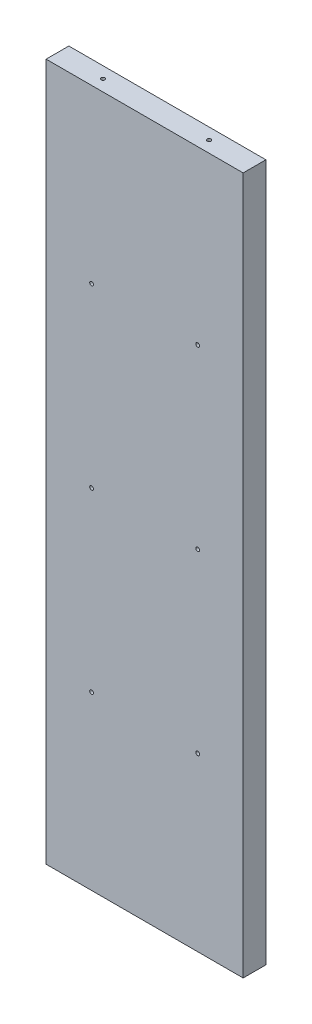
ISO-10303-21;
HEADER;
FILE_DESCRIPTION(('STEP AP214'),'2;1');
FILE_NAME('part.step','',(''),(''),'','','');
FILE_SCHEMA(('AUTOMOTIVE_DESIGN { 1 0 10303 214 1 1 1 1 }'));
ENDSEC;
DATA;
#1=APPLICATION_CONTEXT('core data for automotive mechanical design processes');
#2=APPLICATION_PROTOCOL_DEFINITION('international standard','automotive_design',2000,#1);
#3=PRODUCT_CONTEXT('',#1,'mechanical');
#4=PRODUCT('Part','Part','',(#3));
#5=PRODUCT_RELATED_PRODUCT_CATEGORY('part','',(#4));
#6=PRODUCT_DEFINITION_FORMATION('','',#4);
#7=PRODUCT_DEFINITION_CONTEXT('part definition',#1,'design');
#8=PRODUCT_DEFINITION('design','',#6,#7);
#9=PRODUCT_DEFINITION_SHAPE('','',#8);
#10=(LENGTH_UNIT() NAMED_UNIT(*) SI_UNIT(.MILLI.,.METRE.));
#11=(NAMED_UNIT(*) PLANE_ANGLE_UNIT() SI_UNIT($,.RADIAN.));
#12=(NAMED_UNIT(*) SI_UNIT($,.STERADIAN.) SOLID_ANGLE_UNIT());
#13=UNCERTAINTY_MEASURE_WITH_UNIT(LENGTH_MEASURE(1.E-05),#10,'distance_accuracy_value','');
#14=(GEOMETRIC_REPRESENTATION_CONTEXT(3) GLOBAL_UNCERTAINTY_ASSIGNED_CONTEXT((#13)) GLOBAL_UNIT_ASSIGNED_CONTEXT((#10,
#11,#12)) REPRESENTATION_CONTEXT('',''));
#15=CARTESIAN_POINT('',(0.,0.,0.));
#16=DIRECTION('',(0.,0.,1.));
#17=DIRECTION('',(1.,0.,0.));
#18=AXIS2_PLACEMENT_3D('',#15,#16,#17);
#19=CARTESIAN_POINT('',(195.,1380.,22.5));
#20=DIRECTION('',(-1.,0.,0.));
#21=DIRECTION('',(0.,0.,1.));
#22=AXIS2_PLACEMENT_3D('',#19,#20,#21);
#23=PLANE('',#22);
#24=DIRECTION('',(0.,0.,-1.));
#25=VECTOR('',#24,1.);
#26=CARTESIAN_POINT('',(195.,0.,22.5));
#27=LINE('',#26,#25);
#28=CARTESIAN_POINT('',(195.,0.,22.5));
#29=VERTEX_POINT('',#28);
#30=CARTESIAN_POINT('',(195.,0.,-22.5));
#31=VERTEX_POINT('',#30);
#32=EDGE_CURVE('E102',#29,#31,#27,.T.);
#33=ORIENTED_EDGE('',*,*,#32,.T.);
#34=DIRECTION('',(0.,-1.,0.));
#35=VECTOR('',#34,1.);
#36=CARTESIAN_POINT('',(195.,1380.,-22.5));
#37=LINE('',#36,#35);
#38=CARTESIAN_POINT('',(195.,1380.,-22.5));
#39=VERTEX_POINT('',#38);
#40=EDGE_CURVE('E11',#39,#31,#37,.T.);
#41=ORIENTED_EDGE('',*,*,#40,.F.);
#42=DIRECTION('',(0.,0.,-1.));
#43=VECTOR('',#42,1.);
#44=CARTESIAN_POINT('',(195.,1380.,22.5));
#45=LINE('',#44,#43);
#46=CARTESIAN_POINT('',(195.,1380.,22.5));
#47=VERTEX_POINT('',#46);
#48=EDGE_CURVE('E95',#47,#39,#45,.T.);
#49=ORIENTED_EDGE('',*,*,#48,.F.);
#50=DIRECTION('',(0.,-1.,0.));
#51=VECTOR('',#50,1.);
#52=CARTESIAN_POINT('',(195.,1380.,22.5));
#53=LINE('',#52,#51);
#54=EDGE_CURVE('E99',#47,#29,#53,.T.);
#55=ORIENTED_EDGE('',*,*,#54,.T.);
#56=EDGE_LOOP('',(#33,#41,#49,#55));
#57=FACE_BOUND('',#56,.T.);
#58=ADVANCED_FACE('F41',(#57),#23,.F.);
#59=CARTESIAN_POINT('',(-195.,1380.,-22.5));
#60=DIRECTION('',(0.,0.,1.));
#61=DIRECTION('',(1.,0.,0.));
#62=AXIS2_PLACEMENT_3D('',#59,#60,#61);
#63=PLANE('',#62);
#64=DIRECTION('',(-1.,0.,0.));
#65=VECTOR('',#64,1.);
#66=CARTESIAN_POINT('',(-195.,0.,-22.5));
#67=LINE('',#66,#65);
#68=CARTESIAN_POINT('',(-195.,0.,-22.5));
#69=VERTEX_POINT('',#68);
#70=EDGE_CURVE('E96',#31,#69,#67,.T.);
#71=ORIENTED_EDGE('',*,*,#70,.T.);
#72=DIRECTION('',(0.,-1.,0.));
#73=VECTOR('',#72,1.);
#74=CARTESIAN_POINT('',(-195.,1380.,-22.5));
#75=LINE('',#74,#73);
#76=CARTESIAN_POINT('',(-195.,1380.,-22.5));
#77=VERTEX_POINT('',#76);
#78=EDGE_CURVE('E47',#77,#69,#75,.T.);
#79=ORIENTED_EDGE('',*,*,#78,.F.);
#80=DIRECTION('',(-1.,0.,0.));
#81=VECTOR('',#80,1.);
#82=CARTESIAN_POINT('',(-195.,1380.,-22.5));
#83=LINE('',#82,#81);
#84=EDGE_CURVE('E87',#39,#77,#83,.T.);
#85=ORIENTED_EDGE('',*,*,#84,.F.);
#86=ORIENTED_EDGE('',*,*,#40,.T.);
#87=EDGE_LOOP('',(#71,#79,#85,#86));
#88=FACE_BOUND('',#87,.T.);
#89=ADVANCED_FACE('F92',(#88),#63,.F.);
#90=CARTESIAN_POINT('',(-195.,1380.,22.5));
#91=DIRECTION('',(1.,0.,0.));
#92=DIRECTION('',(0.,0.,-1.));
#93=AXIS2_PLACEMENT_3D('',#90,#91,#92);
#94=PLANE('',#93);
#95=DIRECTION('',(0.,0.,1.));
#96=VECTOR('',#95,1.);
#97=CARTESIAN_POINT('',(-195.,0.,22.5));
#98=LINE('',#97,#96);
#99=CARTESIAN_POINT('',(-195.,0.,22.5));
#100=VERTEX_POINT('',#99);
#101=EDGE_CURVE('E74',#69,#100,#98,.T.);
#102=ORIENTED_EDGE('',*,*,#101,.T.);
#103=DIRECTION('',(0.,-1.,0.));
#104=VECTOR('',#103,1.);
#105=CARTESIAN_POINT('',(-195.,1380.,22.5));
#106=LINE('',#105,#104);
#107=CARTESIAN_POINT('',(-195.,1380.,22.5));
#108=VERTEX_POINT('',#107);
#109=EDGE_CURVE('E100',#108,#100,#106,.T.);
#110=ORIENTED_EDGE('',*,*,#109,.F.);
#111=DIRECTION('',(0.,0.,1.));
#112=VECTOR('',#111,1.);
#113=CARTESIAN_POINT('',(-195.,1380.,22.5));
#114=LINE('',#113,#112);
#115=EDGE_CURVE('E89',#77,#108,#114,.T.);
#116=ORIENTED_EDGE('',*,*,#115,.F.);
#117=ORIENTED_EDGE('',*,*,#78,.T.);
#118=EDGE_LOOP('',(#102,#110,#116,#117));
#119=FACE_BOUND('',#118,.T.);
#120=ADVANCED_FACE('F98',(#119),#94,.F.);
#121=CARTESIAN_POINT('',(-195.,1380.,22.5));
#122=DIRECTION('',(0.,0.,-1.));
#123=DIRECTION('',(-1.,0.,0.));
#124=AXIS2_PLACEMENT_3D('',#121,#122,#123);
#125=PLANE('',#124);
#126=CARTESIAN_POINT('',(105.,1040.,22.5));
#127=DIRECTION('',(0.,0.,1.));
#128=DIRECTION('',(-1.,0.,0.));
#129=AXIS2_PLACEMENT_3D('',#126,#127,#128);
#130=CIRCLE('',#129,3.74999999999992);
#131=CARTESIAN_POINT('',(101.25,1040.,22.5));
#132=VERTEX_POINT('',#131);
#133=EDGE_CURVE('E123',#132,#132,#130,.T.);
#134=ORIENTED_EDGE('',*,*,#133,.F.);
#135=EDGE_LOOP('',(#134));
#136=FACE_BOUND('',#135,.T.);
#137=CARTESIAN_POINT('',(-105.,690.,22.5));
#138=DIRECTION('',(0.,0.,1.));
#139=DIRECTION('',(1.,0.,0.));
#140=AXIS2_PLACEMENT_3D('',#137,#138,#139);
#141=CIRCLE('',#140,3.74999999999995);
#142=CARTESIAN_POINT('',(-101.25,690.,22.5));
#143=VERTEX_POINT('',#142);
#144=EDGE_CURVE('E137',#143,#143,#141,.T.);
#145=ORIENTED_EDGE('',*,*,#144,.F.);
#146=EDGE_LOOP('',(#145));
#147=FACE_BOUND('',#146,.T.);
#148=CARTESIAN_POINT('',(-105.,340.,22.5));
#149=DIRECTION('',(0.,0.,1.));
#150=DIRECTION('',(1.,0.,0.));
#151=AXIS2_PLACEMENT_3D('',#148,#149,#150);
#152=CIRCLE('',#151,3.75000000000001);
#153=CARTESIAN_POINT('',(-101.25,340.,22.5));
#154=VERTEX_POINT('',#153);
#155=EDGE_CURVE('E133',#154,#154,#152,.T.);
#156=ORIENTED_EDGE('',*,*,#155,.F.);
#157=EDGE_LOOP('',(#156));
#158=FACE_BOUND('',#157,.T.);
#159=CARTESIAN_POINT('',(105.,340.,22.5));
#160=DIRECTION('',(0.,0.,1.));
#161=DIRECTION('',(-1.,0.,0.));
#162=AXIS2_PLACEMENT_3D('',#159,#160,#161);
#163=CIRCLE('',#162,3.75000000000001);
#164=CARTESIAN_POINT('',(101.25,340.,22.5));
#165=VERTEX_POINT('',#164);
#166=EDGE_CURVE('E130',#165,#165,#163,.T.);
#167=ORIENTED_EDGE('',*,*,#166,.F.);
#168=EDGE_LOOP('',(#167));
#169=FACE_BOUND('',#168,.T.);
#170=CARTESIAN_POINT('',(105.,690.,22.5));
#171=DIRECTION('',(0.,0.,1.));
#172=DIRECTION('',(-1.,0.,0.));
#173=AXIS2_PLACEMENT_3D('',#170,#171,#172);
#174=CIRCLE('',#173,3.74999999999995);
#175=CARTESIAN_POINT('',(101.25,690.,22.5));
#176=VERTEX_POINT('',#175);
#177=EDGE_CURVE('E126',#176,#176,#174,.T.);
#178=ORIENTED_EDGE('',*,*,#177,.F.);
#179=EDGE_LOOP('',(#178));
#180=FACE_BOUND('',#179,.T.);
#181=CARTESIAN_POINT('',(-105.,1040.,22.5));
#182=DIRECTION('',(0.,0.,1.));
#183=DIRECTION('',(1.,0.,0.));
#184=AXIS2_PLACEMENT_3D('',#181,#182,#183);
#185=CIRCLE('',#184,3.74999999999992);
#186=CARTESIAN_POINT('',(-101.25,1040.,22.5));
#187=VERTEX_POINT('',#186);
#188=EDGE_CURVE('E119',#187,#187,#185,.T.);
#189=ORIENTED_EDGE('',*,*,#188,.F.);
#190=EDGE_LOOP('',(#189));
#191=FACE_BOUND('',#190,.T.);
#192=DIRECTION('',(1.,0.,0.));
#193=VECTOR('',#192,1.);
#194=CARTESIAN_POINT('',(-195.,0.,22.5));
#195=LINE('',#194,#193);
#196=EDGE_CURVE('E80',#100,#29,#195,.T.);
#197=ORIENTED_EDGE('',*,*,#196,.T.);
#198=ORIENTED_EDGE('',*,*,#54,.F.);
#199=DIRECTION('',(1.,0.,0.));
#200=VECTOR('',#199,1.);
#201=CARTESIAN_POINT('',(-195.,1380.,22.5));
#202=LINE('',#201,#200);
#203=EDGE_CURVE('E60',#108,#47,#202,.T.);
#204=ORIENTED_EDGE('',*,*,#203,.F.);
#205=ORIENTED_EDGE('',*,*,#109,.T.);
#206=EDGE_LOOP('',(#197,#198,#204,#205));
#207=FACE_BOUND('',#206,.T.);
#208=ADVANCED_FACE('F115',(#136,#147,#158,#169,#180,#191,#207),#125,.F.);
#209=CARTESIAN_POINT('',(0.,1380.,0.));
#210=DIRECTION('',(0.,-1.,0.));
#211=DIRECTION('',(0.,0.,-1.));
#212=AXIS2_PLACEMENT_3D('',#209,#210,#211);
#213=PLANE('',#212);
#214=CARTESIAN_POINT('',(-105.,1380.,0.));
#215=DIRECTION('',(0.,1.,0.));
#216=DIRECTION('',(0.,0.,1.));
#217=AXIS2_PLACEMENT_3D('',#214,#215,#216);
#218=CIRCLE('',#217,3.75000000000001);
#219=CARTESIAN_POINT('',(-105.,1380.,3.75000000000004));
#220=VERTEX_POINT('',#219);
#221=EDGE_CURVE('E161',#220,#220,#218,.T.);
#222=ORIENTED_EDGE('',*,*,#221,.F.);
#223=EDGE_LOOP('',(#222));
#224=FACE_BOUND('',#223,.T.);
#225=CARTESIAN_POINT('',(105.,1380.,0.));
#226=DIRECTION('',(0.,1.,0.));
#227=DIRECTION('',(0.,0.,1.));
#228=AXIS2_PLACEMENT_3D('',#225,#226,#227);
#229=CIRCLE('',#228,3.75000000000001);
#230=CARTESIAN_POINT('',(105.,1380.,3.75000000000002));
#231=VERTEX_POINT('',#230);
#232=EDGE_CURVE('E160',#231,#231,#229,.T.);
#233=ORIENTED_EDGE('',*,*,#232,.F.);
#234=EDGE_LOOP('',(#233));
#235=FACE_BOUND('',#234,.T.);
#236=ORIENTED_EDGE('',*,*,#48,.T.);
#237=ORIENTED_EDGE('',*,*,#84,.T.);
#238=ORIENTED_EDGE('',*,*,#115,.T.);
#239=ORIENTED_EDGE('',*,*,#203,.T.);
#240=EDGE_LOOP('',(#236,#237,#238,#239));
#241=FACE_BOUND('',#240,.T.);
#242=ADVANCED_FACE('F86',(#224,#235,#241),#213,.F.);
#243=CARTESIAN_POINT('',(0.,0.,0.));
#244=DIRECTION('',(0.,-1.,0.));
#245=DIRECTION('',(0.,0.,-1.));
#246=AXIS2_PLACEMENT_3D('',#243,#244,#245);
#247=PLANE('',#246);
#248=CARTESIAN_POINT('',(-105.,0.,0.));
#249=DIRECTION('',(0.,-1.,0.));
#250=DIRECTION('',(0.,0.,-1.));
#251=AXIS2_PLACEMENT_3D('',#248,#249,#250);
#252=CIRCLE('',#251,3.75000000000001);
#253=CARTESIAN_POINT('',(-105.,0.,-3.75000000000004));
#254=VERTEX_POINT('',#253);
#255=EDGE_CURVE('E172',#254,#254,#252,.T.);
#256=ORIENTED_EDGE('',*,*,#255,.F.);
#257=EDGE_LOOP('',(#256));
#258=FACE_BOUND('',#257,.T.);
#259=CARTESIAN_POINT('',(105.,0.,0.));
#260=DIRECTION('',(0.,-1.,0.));
#261=DIRECTION('',(0.,0.,-1.));
#262=AXIS2_PLACEMENT_3D('',#259,#260,#261);
#263=CIRCLE('',#262,3.75000000000001);
#264=CARTESIAN_POINT('',(105.,0.,-3.75000000000002));
#265=VERTEX_POINT('',#264);
#266=EDGE_CURVE('E166',#265,#265,#263,.T.);
#267=ORIENTED_EDGE('',*,*,#266,.F.);
#268=EDGE_LOOP('',(#267));
#269=FACE_BOUND('',#268,.T.);
#270=ORIENTED_EDGE('',*,*,#32,.F.);
#271=ORIENTED_EDGE('',*,*,#196,.F.);
#272=ORIENTED_EDGE('',*,*,#101,.F.);
#273=ORIENTED_EDGE('',*,*,#70,.F.);
#274=EDGE_LOOP('',(#270,#271,#272,#273));
#275=FACE_BOUND('',#274,.T.);
#276=ADVANCED_FACE('F113',(#258,#269,#275),#247,.T.);
#277=CARTESIAN_POINT('',(-105.,1040.,2.5));
#278=DIRECTION('',(0.,0.,1.));
#279=DIRECTION('',(1.,0.,0.));
#280=AXIS2_PLACEMENT_3D('',#277,#278,#279);
#281=CYLINDRICAL_SURFACE('',#280,3.74999999999992);
#282=CARTESIAN_POINT('',(-105.,1040.,2.5));
#283=DIRECTION('',(0.,0.,1.));
#284=DIRECTION('',(1.,0.,0.));
#285=AXIS2_PLACEMENT_3D('',#282,#283,#284);
#286=CIRCLE('',#285,3.74999999999992);
#287=CARTESIAN_POINT('',(-101.25,1040.,2.5));
#288=VERTEX_POINT('',#287);
#289=EDGE_CURVE('E110',#288,#288,#286,.T.);
#290=ORIENTED_EDGE('',*,*,#289,.F.);
#291=EDGE_LOOP('',(#290));
#292=FACE_BOUND('',#291,.T.);
#293=ORIENTED_EDGE('',*,*,#188,.T.);
#294=EDGE_LOOP('',(#293));
#295=FACE_BOUND('',#294,.T.);
#296=ADVANCED_FACE('F188',(#292,#295),#281,.F.);
#297=CARTESIAN_POINT('',(-105.,1040.,2.5));
#298=DIRECTION('',(0.,0.,1.));
#299=DIRECTION('',(1.,0.,0.));
#300=AXIS2_PLACEMENT_3D('',#297,#298,#299);
#301=PLANE('',#300);
#302=ORIENTED_EDGE('',*,*,#289,.T.);
#303=EDGE_LOOP('',(#302));
#304=FACE_BOUND('',#303,.T.);
#305=ADVANCED_FACE('F223',(#304),#301,.T.);
#306=CARTESIAN_POINT('',(105.,690.,2.5));
#307=DIRECTION('',(0.,0.,1.));
#308=DIRECTION('',(1.,0.,0.));
#309=AXIS2_PLACEMENT_3D('',#306,#307,#308);
#310=CYLINDRICAL_SURFACE('',#309,3.74999999999995);
#311=CARTESIAN_POINT('',(105.,690.,2.5));
#312=DIRECTION('',(0.,0.,1.));
#313=DIRECTION('',(-1.,0.,0.));
#314=AXIS2_PLACEMENT_3D('',#311,#312,#313);
#315=CIRCLE('',#314,3.74999999999995);
#316=CARTESIAN_POINT('',(101.25,690.,2.5));
#317=VERTEX_POINT('',#316);
#318=EDGE_CURVE('E146',#317,#317,#315,.T.);
#319=ORIENTED_EDGE('',*,*,#318,.F.);
#320=EDGE_LOOP('',(#319));
#321=FACE_BOUND('',#320,.T.);
#322=ORIENTED_EDGE('',*,*,#177,.T.);
#323=EDGE_LOOP('',(#322));
#324=FACE_BOUND('',#323,.T.);
#325=ADVANCED_FACE('F228',(#321,#324),#310,.F.);
#326=CARTESIAN_POINT('',(105.,690.,2.5));
#327=DIRECTION('',(0.,0.,-1.));
#328=DIRECTION('',(-1.,0.,0.));
#329=AXIS2_PLACEMENT_3D('',#326,#327,#328);
#330=PLANE('',#329);
#331=ORIENTED_EDGE('',*,*,#318,.T.);
#332=EDGE_LOOP('',(#331));
#333=FACE_BOUND('',#332,.T.);
#334=ADVANCED_FACE('F239',(#333),#330,.F.);
#335=CARTESIAN_POINT('',(105.,340.,2.5));
#336=DIRECTION('',(0.,0.,1.));
#337=DIRECTION('',(1.,0.,0.));
#338=AXIS2_PLACEMENT_3D('',#335,#336,#337);
#339=CYLINDRICAL_SURFACE('',#338,3.75000000000001);
#340=CARTESIAN_POINT('',(105.,340.,2.5));
#341=DIRECTION('',(0.,0.,1.));
#342=DIRECTION('',(-1.,0.,0.));
#343=AXIS2_PLACEMENT_3D('',#340,#341,#342);
#344=CIRCLE('',#343,3.75000000000001);
#345=CARTESIAN_POINT('',(101.25,340.,2.5));
#346=VERTEX_POINT('',#345);
#347=EDGE_CURVE('E124',#346,#346,#344,.T.);
#348=ORIENTED_EDGE('',*,*,#347,.F.);
#349=EDGE_LOOP('',(#348));
#350=FACE_BOUND('',#349,.T.);
#351=ORIENTED_EDGE('',*,*,#166,.T.);
#352=EDGE_LOOP('',(#351));
#353=FACE_BOUND('',#352,.T.);
#354=ADVANCED_FACE('F232',(#350,#353),#339,.F.);
#355=CARTESIAN_POINT('',(105.,340.,2.5));
#356=DIRECTION('',(0.,0.,-1.));
#357=DIRECTION('',(-1.,0.,0.));
#358=AXIS2_PLACEMENT_3D('',#355,#356,#357);
#359=PLANE('',#358);
#360=ORIENTED_EDGE('',*,*,#347,.T.);
#361=EDGE_LOOP('',(#360));
#362=FACE_BOUND('',#361,.T.);
#363=ADVANCED_FACE('F233',(#362),#359,.F.);
#364=CARTESIAN_POINT('',(-105.,340.,2.5));
#365=DIRECTION('',(0.,0.,1.));
#366=DIRECTION('',(1.,0.,0.));
#367=AXIS2_PLACEMENT_3D('',#364,#365,#366);
#368=CYLINDRICAL_SURFACE('',#367,3.75000000000001);
#369=CARTESIAN_POINT('',(-105.,340.,2.5));
#370=DIRECTION('',(0.,0.,1.));
#371=DIRECTION('',(1.,0.,0.));
#372=AXIS2_PLACEMENT_3D('',#369,#370,#371);
#373=CIRCLE('',#372,3.75000000000001);
#374=CARTESIAN_POINT('',(-101.25,340.,2.5));
#375=VERTEX_POINT('',#374);
#376=EDGE_CURVE('E131',#375,#375,#373,.T.);
#377=ORIENTED_EDGE('',*,*,#376,.F.);
#378=EDGE_LOOP('',(#377));
#379=FACE_BOUND('',#378,.T.);
#380=ORIENTED_EDGE('',*,*,#155,.T.);
#381=EDGE_LOOP('',(#380));
#382=FACE_BOUND('',#381,.T.);
#383=ADVANCED_FACE('F234',(#379,#382),#368,.F.);
#384=CARTESIAN_POINT('',(-105.,340.,2.5));
#385=DIRECTION('',(0.,0.,1.));
#386=DIRECTION('',(1.,0.,0.));
#387=AXIS2_PLACEMENT_3D('',#384,#385,#386);
#388=PLANE('',#387);
#389=ORIENTED_EDGE('',*,*,#376,.T.);
#390=EDGE_LOOP('',(#389));
#391=FACE_BOUND('',#390,.T.);
#392=ADVANCED_FACE('F241',(#391),#388,.T.);
#393=CARTESIAN_POINT('',(-105.,690.,2.5));
#394=DIRECTION('',(0.,0.,1.));
#395=DIRECTION('',(1.,0.,0.));
#396=AXIS2_PLACEMENT_3D('',#393,#394,#395);
#397=CYLINDRICAL_SURFACE('',#396,3.74999999999995);
#398=CARTESIAN_POINT('',(-105.,690.,2.5));
#399=DIRECTION('',(0.,0.,1.));
#400=DIRECTION('',(1.,0.,0.));
#401=AXIS2_PLACEMENT_3D('',#398,#399,#400);
#402=CIRCLE('',#401,3.74999999999995);
#403=CARTESIAN_POINT('',(-101.25,690.,2.5));
#404=VERTEX_POINT('',#403);
#405=EDGE_CURVE('E140',#404,#404,#402,.T.);
#406=ORIENTED_EDGE('',*,*,#405,.F.);
#407=EDGE_LOOP('',(#406));
#408=FACE_BOUND('',#407,.T.);
#409=ORIENTED_EDGE('',*,*,#144,.T.);
#410=EDGE_LOOP('',(#409));
#411=FACE_BOUND('',#410,.T.);
#412=ADVANCED_FACE('F243',(#408,#411),#397,.F.);
#413=CARTESIAN_POINT('',(-105.,690.,2.5));
#414=DIRECTION('',(0.,0.,1.));
#415=DIRECTION('',(1.,0.,0.));
#416=AXIS2_PLACEMENT_3D('',#413,#414,#415);
#417=PLANE('',#416);
#418=ORIENTED_EDGE('',*,*,#405,.T.);
#419=EDGE_LOOP('',(#418));
#420=FACE_BOUND('',#419,.T.);
#421=ADVANCED_FACE('F249',(#420),#417,.T.);
#422=CARTESIAN_POINT('',(105.,1040.,2.5));
#423=DIRECTION('',(0.,0.,1.));
#424=DIRECTION('',(1.,0.,0.));
#425=AXIS2_PLACEMENT_3D('',#422,#423,#424);
#426=CYLINDRICAL_SURFACE('',#425,3.74999999999992);
#427=CARTESIAN_POINT('',(105.,1040.,2.5));
#428=DIRECTION('',(0.,0.,1.));
#429=DIRECTION('',(-1.,0.,0.));
#430=AXIS2_PLACEMENT_3D('',#427,#428,#429);
#431=CIRCLE('',#430,3.74999999999992);
#432=CARTESIAN_POINT('',(101.25,1040.,2.5));
#433=VERTEX_POINT('',#432);
#434=EDGE_CURVE('E141',#433,#433,#431,.T.);
#435=ORIENTED_EDGE('',*,*,#434,.F.);
#436=EDGE_LOOP('',(#435));
#437=FACE_BOUND('',#436,.T.);
#438=ORIENTED_EDGE('',*,*,#133,.T.);
#439=EDGE_LOOP('',(#438));
#440=FACE_BOUND('',#439,.T.);
#441=ADVANCED_FACE('F252',(#437,#440),#426,.F.);
#442=CARTESIAN_POINT('',(105.,1040.,2.5));
#443=DIRECTION('',(0.,0.,-1.));
#444=DIRECTION('',(-1.,0.,0.));
#445=AXIS2_PLACEMENT_3D('',#442,#443,#444);
#446=PLANE('',#445);
#447=ORIENTED_EDGE('',*,*,#434,.T.);
#448=EDGE_LOOP('',(#447));
#449=FACE_BOUND('',#448,.T.);
#450=ADVANCED_FACE('F260',(#449),#446,.F.);
#451=CARTESIAN_POINT('',(105.,1360.,0.));
#452=DIRECTION('',(0.,1.,0.));
#453=DIRECTION('',(0.,0.,1.));
#454=AXIS2_PLACEMENT_3D('',#451,#452,#453);
#455=CYLINDRICAL_SURFACE('',#454,3.75000000000001);
#456=CARTESIAN_POINT('',(105.,1360.,0.));
#457=DIRECTION('',(0.,1.,0.));
#458=DIRECTION('',(0.,0.,1.));
#459=AXIS2_PLACEMENT_3D('',#456,#457,#458);
#460=CIRCLE('',#459,3.75000000000001);
#461=CARTESIAN_POINT('',(105.,1360.,3.75000000000002));
#462=VERTEX_POINT('',#461);
#463=EDGE_CURVE('E152',#462,#462,#460,.T.);
#464=ORIENTED_EDGE('',*,*,#463,.F.);
#465=EDGE_LOOP('',(#464));
#466=FACE_BOUND('',#465,.T.);
#467=ORIENTED_EDGE('',*,*,#232,.T.);
#468=EDGE_LOOP('',(#467));
#469=FACE_BOUND('',#468,.T.);
#470=ADVANCED_FACE('F257',(#466,#469),#455,.F.);
#471=CARTESIAN_POINT('',(105.,1360.,0.));
#472=DIRECTION('',(0.,1.,0.));
#473=DIRECTION('',(0.,0.,1.));
#474=AXIS2_PLACEMENT_3D('',#471,#472,#473);
#475=PLANE('',#474);
#476=ORIENTED_EDGE('',*,*,#463,.T.);
#477=EDGE_LOOP('',(#476));
#478=FACE_BOUND('',#477,.T.);
#479=ADVANCED_FACE('F271',(#478),#475,.T.);
#480=CARTESIAN_POINT('',(-105.,1360.,0.));
#481=DIRECTION('',(0.,1.,0.));
#482=DIRECTION('',(0.,0.,1.));
#483=AXIS2_PLACEMENT_3D('',#480,#481,#482);
#484=CYLINDRICAL_SURFACE('',#483,3.75000000000001);
#485=CARTESIAN_POINT('',(-105.,1360.,0.));
#486=DIRECTION('',(0.,1.,0.));
#487=DIRECTION('',(0.,0.,1.));
#488=AXIS2_PLACEMENT_3D('',#485,#486,#487);
#489=CIRCLE('',#488,3.75000000000001);
#490=CARTESIAN_POINT('',(-105.,1360.,3.75000000000004));
#491=VERTEX_POINT('',#490);
#492=EDGE_CURVE('E151',#491,#491,#489,.T.);
#493=ORIENTED_EDGE('',*,*,#492,.F.);
#494=EDGE_LOOP('',(#493));
#495=FACE_BOUND('',#494,.T.);
#496=ORIENTED_EDGE('',*,*,#221,.T.);
#497=EDGE_LOOP('',(#496));
#498=FACE_BOUND('',#497,.T.);
#499=ADVANCED_FACE('F204',(#495,#498),#484,.F.);
#500=CARTESIAN_POINT('',(-105.,1360.,0.));
#501=DIRECTION('',(0.,1.,0.));
#502=DIRECTION('',(0.,0.,1.));
#503=AXIS2_PLACEMENT_3D('',#500,#501,#502);
#504=PLANE('',#503);
#505=ORIENTED_EDGE('',*,*,#492,.T.);
#506=EDGE_LOOP('',(#505));
#507=FACE_BOUND('',#506,.T.);
#508=ADVANCED_FACE('F192',(#507),#504,.T.);
#509=CARTESIAN_POINT('',(105.,20.,0.));
#510=DIRECTION('',(0.,-1.,0.));
#511=DIRECTION('',(0.,0.,-1.));
#512=AXIS2_PLACEMENT_3D('',#509,#510,#511);
#513=CYLINDRICAL_SURFACE('',#512,3.75000000000001);
#514=CARTESIAN_POINT('',(105.,20.,0.));
#515=DIRECTION('',(0.,-1.,0.));
#516=DIRECTION('',(0.,0.,-1.));
#517=AXIS2_PLACEMENT_3D('',#514,#515,#516);
#518=CIRCLE('',#517,3.75000000000001);
#519=CARTESIAN_POINT('',(105.,20.,-3.75000000000002));
#520=VERTEX_POINT('',#519);
#521=EDGE_CURVE('E167',#520,#520,#518,.T.);
#522=ORIENTED_EDGE('',*,*,#521,.F.);
#523=EDGE_LOOP('',(#522));
#524=FACE_BOUND('',#523,.T.);
#525=ORIENTED_EDGE('',*,*,#266,.T.);
#526=EDGE_LOOP('',(#525));
#527=FACE_BOUND('',#526,.T.);
#528=ADVANCED_FACE('F191',(#524,#527),#513,.F.);
#529=CARTESIAN_POINT('',(105.,20.,0.));
#530=DIRECTION('',(0.,-1.,0.));
#531=DIRECTION('',(0.,0.,-1.));
#532=AXIS2_PLACEMENT_3D('',#529,#530,#531);
#533=PLANE('',#532);
#534=ORIENTED_EDGE('',*,*,#521,.T.);
#535=EDGE_LOOP('',(#534));
#536=FACE_BOUND('',#535,.T.);
#537=ADVANCED_FACE('F181',(#536),#533,.T.);
#538=CARTESIAN_POINT('',(-105.,20.,0.));
#539=DIRECTION('',(0.,-1.,0.));
#540=DIRECTION('',(0.,0.,-1.));
#541=AXIS2_PLACEMENT_3D('',#538,#539,#540);
#542=CYLINDRICAL_SURFACE('',#541,3.75000000000001);
#543=CARTESIAN_POINT('',(-105.,20.,0.));
#544=DIRECTION('',(0.,-1.,0.));
#545=DIRECTION('',(0.,0.,-1.));
#546=AXIS2_PLACEMENT_3D('',#543,#544,#545);
#547=CIRCLE('',#546,3.75000000000001);
#548=CARTESIAN_POINT('',(-105.,20.,-3.75000000000004));
#549=VERTEX_POINT('',#548);
#550=EDGE_CURVE('E158',#549,#549,#547,.T.);
#551=ORIENTED_EDGE('',*,*,#550,.F.);
#552=EDGE_LOOP('',(#551));
#553=FACE_BOUND('',#552,.T.);
#554=ORIENTED_EDGE('',*,*,#255,.T.);
#555=EDGE_LOOP('',(#554));
#556=FACE_BOUND('',#555,.T.);
#557=ADVANCED_FACE('F177',(#553,#556),#542,.F.);
#558=CARTESIAN_POINT('',(-105.,20.,0.));
#559=DIRECTION('',(0.,-1.,0.));
#560=DIRECTION('',(0.,0.,-1.));
#561=AXIS2_PLACEMENT_3D('',#558,#559,#560);
#562=PLANE('',#561);
#563=ORIENTED_EDGE('',*,*,#550,.T.);
#564=EDGE_LOOP('',(#563));
#565=FACE_BOUND('',#564,.T.);
#566=ADVANCED_FACE('F176',(#565),#562,.T.);
#567=CLOSED_SHELL('',(#58,#89,#120,#208,#242,#276,#296,#305,#325,#334,#354,#363,#383,#392,#412,
#421,#441,#450,#470,#479,#499,#508,#528,#537,#557,#566));
#568=MANIFOLD_SOLID_BREP('B2',#567);
#569=ADVANCED_BREP_SHAPE_REPRESENTATION('',(#18,#568),#14);
#570=SHAPE_DEFINITION_REPRESENTATION(#9,#569);
ENDSEC;
END-ISO-10303-21;
